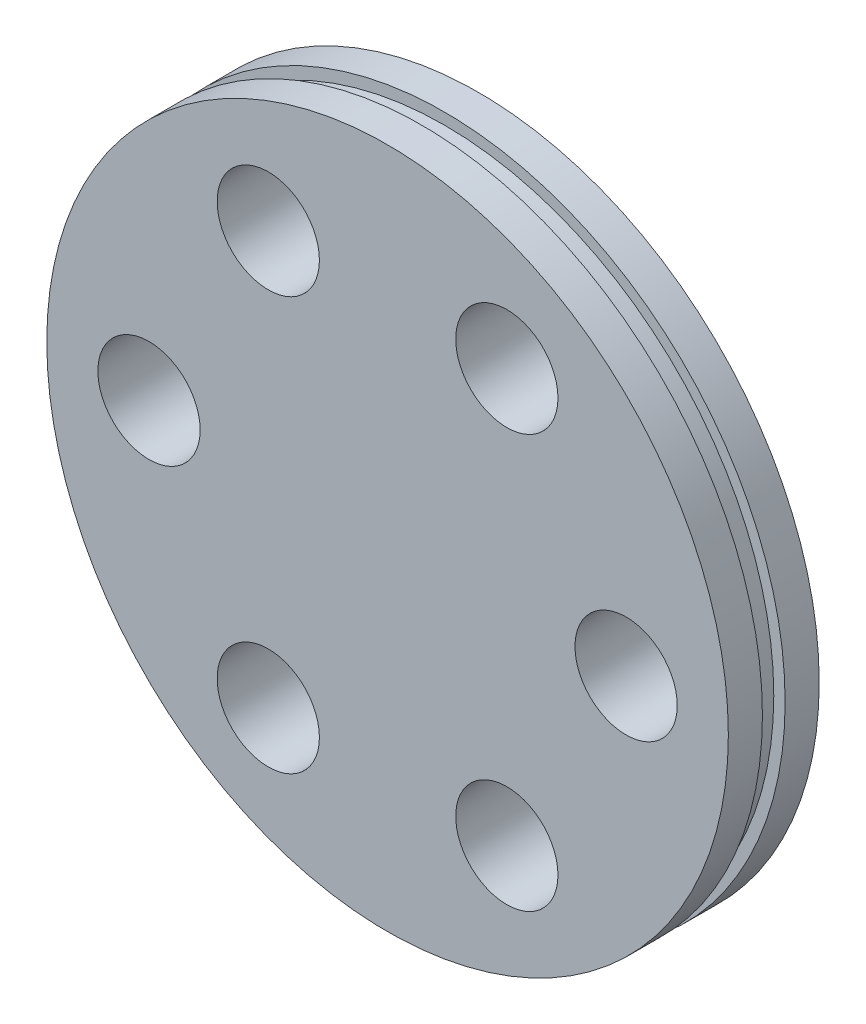
ISO-10303-21;
HEADER;
FILE_DESCRIPTION(('STEP AP214'),'2;1');
FILE_NAME('part.step','',(''),(''),'','','');
FILE_SCHEMA(('AUTOMOTIVE_DESIGN { 1 0 10303 214 1 1 1 1 }'));
ENDSEC;
DATA;
#1=APPLICATION_CONTEXT('core data for automotive mechanical design processes');
#2=APPLICATION_PROTOCOL_DEFINITION('international standard','automotive_design',2000,#1);
#3=PRODUCT_CONTEXT('',#1,'mechanical');
#4=PRODUCT('Part','Part','',(#3));
#5=PRODUCT_RELATED_PRODUCT_CATEGORY('part','',(#4));
#6=PRODUCT_DEFINITION_FORMATION('','',#4);
#7=PRODUCT_DEFINITION_CONTEXT('part definition',#1,'design');
#8=PRODUCT_DEFINITION('design','',#6,#7);
#9=PRODUCT_DEFINITION_SHAPE('','',#8);
#10=(LENGTH_UNIT() NAMED_UNIT(*) SI_UNIT(.MILLI.,.METRE.));
#11=(NAMED_UNIT(*) PLANE_ANGLE_UNIT() SI_UNIT($,.RADIAN.));
#12=(NAMED_UNIT(*) SI_UNIT($,.STERADIAN.) SOLID_ANGLE_UNIT());
#13=UNCERTAINTY_MEASURE_WITH_UNIT(LENGTH_MEASURE(1.E-05),#10,'distance_accuracy_value','');
#14=(GEOMETRIC_REPRESENTATION_CONTEXT(3) GLOBAL_UNCERTAINTY_ASSIGNED_CONTEXT((#13)) GLOBAL_UNIT_ASSIGNED_CONTEXT((#10,
#11,#12)) REPRESENTATION_CONTEXT('',''));
#15=CARTESIAN_POINT('',(0.,0.,0.));
#16=DIRECTION('',(0.,0.,1.));
#17=DIRECTION('',(1.,0.,0.));
#18=AXIS2_PLACEMENT_3D('',#15,#16,#17);
#19=CARTESIAN_POINT('',(0.,0.,6.));
#20=DIRECTION('',(0.,0.,-1.));
#21=DIRECTION('',(-1.,0.,0.));
#22=AXIS2_PLACEMENT_3D('',#19,#20,#21);
#23=CYLINDRICAL_SURFACE('',#22,30.);
#24=CARTESIAN_POINT('',(0.,0.,0.));
#25=DIRECTION('',(0.,0.,1.));
#26=DIRECTION('',(1.,0.,0.));
#27=AXIS2_PLACEMENT_3D('',#24,#25,#26);
#28=CIRCLE('',#27,30.);
#29=CARTESIAN_POINT('',(30.,0.,0.));
#30=VERTEX_POINT('',#29);
#31=EDGE_CURVE('E10',#30,#30,#28,.T.);
#32=ORIENTED_EDGE('',*,*,#31,.T.);
#33=EDGE_LOOP('',(#32));
#34=FACE_BOUND('',#33,.T.);
#35=CARTESIAN_POINT('',(0.,0.,3.));
#36=DIRECTION('',(0.,0.,1.));
#37=DIRECTION('',(1.,0.,0.));
#38=AXIS2_PLACEMENT_3D('',#35,#36,#37);
#39=CIRCLE('',#38,30.);
#40=CARTESIAN_POINT('',(30.,0.,3.));
#41=VERTEX_POINT('',#40);
#42=EDGE_CURVE('E67',#41,#41,#39,.T.);
#43=ORIENTED_EDGE('',*,*,#42,.F.);
#44=EDGE_LOOP('',(#43));
#45=FACE_BOUND('',#44,.T.);
#46=ADVANCED_FACE('F41',(#34,#45),#23,.T.);
#47=CARTESIAN_POINT('',(0.,0.,0.));
#48=DIRECTION('',(0.,0.,1.));
#49=DIRECTION('',(1.,0.,0.));
#50=AXIS2_PLACEMENT_3D('',#47,#48,#49);
#51=PLANE('',#50);
#52=CARTESIAN_POINT('',(21.,0.,0.));
#53=DIRECTION('',(0.,0.,1.));
#54=DIRECTION('',(1.,0.,0.));
#55=AXIS2_PLACEMENT_3D('',#52,#53,#54);
#56=CIRCLE('',#55,4.5);
#57=CARTESIAN_POINT('',(25.5,0.,0.));
#58=VERTEX_POINT('',#57);
#59=EDGE_CURVE('E73',#58,#58,#56,.T.);
#60=ORIENTED_EDGE('',*,*,#59,.T.);
#61=EDGE_LOOP('',(#60));
#62=FACE_BOUND('',#61,.T.);
#63=CARTESIAN_POINT('',(10.5,-18.1865334794732,0.));
#64=DIRECTION('',(0.,0.,1.));
#65=DIRECTION('',(1.,0.,0.));
#66=AXIS2_PLACEMENT_3D('',#63,#64,#65);
#67=CIRCLE('',#66,4.5);
#68=CARTESIAN_POINT('',(15.,-18.1865334794732,0.));
#69=VERTEX_POINT('',#68);
#70=EDGE_CURVE('E100',#69,#69,#67,.T.);
#71=ORIENTED_EDGE('',*,*,#70,.T.);
#72=EDGE_LOOP('',(#71));
#73=FACE_BOUND('',#72,.T.);
#74=CARTESIAN_POINT('',(-10.5,-18.1865334794732,0.));
#75=DIRECTION('',(0.,0.,1.));
#76=DIRECTION('',(1.,0.,0.));
#77=AXIS2_PLACEMENT_3D('',#74,#75,#76);
#78=CIRCLE('',#77,4.5);
#79=CARTESIAN_POINT('',(-6.00000000000001,-18.1865334794732,0.));
#80=VERTEX_POINT('',#79);
#81=EDGE_CURVE('E74',#80,#80,#78,.T.);
#82=ORIENTED_EDGE('',*,*,#81,.T.);
#83=EDGE_LOOP('',(#82));
#84=FACE_BOUND('',#83,.T.);
#85=CARTESIAN_POINT('',(-21.,0.,0.));
#86=DIRECTION('',(0.,0.,1.));
#87=DIRECTION('',(1.,0.,0.));
#88=AXIS2_PLACEMENT_3D('',#85,#86,#87);
#89=CIRCLE('',#88,4.5);
#90=CARTESIAN_POINT('',(-16.5,0.,0.));
#91=VERTEX_POINT('',#90);
#92=EDGE_CURVE('E81',#91,#91,#89,.T.);
#93=ORIENTED_EDGE('',*,*,#92,.T.);
#94=EDGE_LOOP('',(#93));
#95=FACE_BOUND('',#94,.T.);
#96=CARTESIAN_POINT('',(-10.5,18.1865334794732,0.));
#97=DIRECTION('',(0.,0.,1.));
#98=DIRECTION('',(1.,0.,0.));
#99=AXIS2_PLACEMENT_3D('',#96,#97,#98);
#100=CIRCLE('',#99,4.5);
#101=CARTESIAN_POINT('',(-5.99999999999999,18.1865334794732,0.));
#102=VERTEX_POINT('',#101);
#103=EDGE_CURVE('E87',#102,#102,#100,.T.);
#104=ORIENTED_EDGE('',*,*,#103,.T.);
#105=EDGE_LOOP('',(#104));
#106=FACE_BOUND('',#105,.T.);
#107=CARTESIAN_POINT('',(10.5,18.1865334794732,0.));
#108=DIRECTION('',(0.,0.,1.));
#109=DIRECTION('',(1.,0.,0.));
#110=AXIS2_PLACEMENT_3D('',#107,#108,#109);
#111=CIRCLE('',#110,4.5);
#112=CARTESIAN_POINT('',(15.,18.1865334794732,0.));
#113=VERTEX_POINT('',#112);
#114=EDGE_CURVE('E93',#113,#113,#111,.T.);
#115=ORIENTED_EDGE('',*,*,#114,.T.);
#116=EDGE_LOOP('',(#115));
#117=FACE_BOUND('',#116,.T.);
#118=ORIENTED_EDGE('',*,*,#31,.F.);
#119=EDGE_LOOP('',(#118));
#120=FACE_BOUND('',#119,.T.);
#121=CARTESIAN_POINT('',(0.,0.,0.));
#122=DIRECTION('',(0.,0.,1.));
#123=DIRECTION('',(1.,0.,0.));
#124=AXIS2_PLACEMENT_3D('',#121,#122,#123);
#125=CIRCLE('',#124,11.);
#126=CARTESIAN_POINT('',(11.,0.,0.));
#127=VERTEX_POINT('',#126);
#128=EDGE_CURVE('E48',#127,#127,#125,.T.);
#129=ORIENTED_EDGE('',*,*,#128,.T.);
#130=EDGE_LOOP('',(#129));
#131=FACE_BOUND('',#130,.T.);
#132=ADVANCED_FACE('F110',(#62,#73,#84,#95,#106,#117,#120,#131),#51,.F.);
#133=CARTESIAN_POINT('',(0.,0.,6.));
#134=DIRECTION('',(0.,0.,-1.));
#135=DIRECTION('',(-1.,0.,0.));
#136=AXIS2_PLACEMENT_3D('',#133,#134,#135);
#137=CYLINDRICAL_SURFACE('',#136,11.);
#138=CARTESIAN_POINT('',(0.,0.,6.));
#139=DIRECTION('',(0.,0.,1.));
#140=DIRECTION('',(1.,0.,0.));
#141=AXIS2_PLACEMENT_3D('',#138,#139,#140);
#142=CIRCLE('',#141,11.);
#143=CARTESIAN_POINT('',(11.,0.,6.));
#144=VERTEX_POINT('',#143);
#145=EDGE_CURVE('E52',#144,#144,#142,.T.);
#146=ORIENTED_EDGE('',*,*,#145,.T.);
#147=EDGE_LOOP('',(#146));
#148=FACE_BOUND('',#147,.T.);
#149=ORIENTED_EDGE('',*,*,#128,.F.);
#150=EDGE_LOOP('',(#149));
#151=FACE_BOUND('',#150,.T.);
#152=ADVANCED_FACE('F153',(#148,#151),#137,.F.);
#153=CARTESIAN_POINT('',(0.,0.,6.));
#154=DIRECTION('',(0.,0.,1.));
#155=DIRECTION('',(1.,0.,0.));
#156=AXIS2_PLACEMENT_3D('',#153,#154,#155);
#157=PLANE('',#156);
#158=ORIENTED_EDGE('',*,*,#145,.F.);
#159=EDGE_LOOP('',(#158));
#160=FACE_BOUND('',#159,.T.);
#161=ADVANCED_FACE('F171',(#160),#157,.F.);
#162=CARTESIAN_POINT('',(0.,0.,5.));
#163=DIRECTION('',(0.,0.,1.));
#164=DIRECTION('',(1.,0.,0.));
#165=AXIS2_PLACEMENT_3D('',#162,#163,#164);
#166=PLANE('',#165);
#167=CARTESIAN_POINT('',(0.,0.,5.));
#168=DIRECTION('',(0.,0.,1.));
#169=DIRECTION('',(1.,0.,0.));
#170=AXIS2_PLACEMENT_3D('',#167,#168,#169);
#171=CIRCLE('',#170,30.);
#172=CARTESIAN_POINT('',(30.,0.,5.));
#173=VERTEX_POINT('',#172);
#174=EDGE_CURVE('E61',#173,#173,#171,.T.);
#175=ORIENTED_EDGE('',*,*,#174,.F.);
#176=EDGE_LOOP('',(#175));
#177=FACE_BOUND('',#176,.T.);
#178=CARTESIAN_POINT('',(0.,0.,5.));
#179=DIRECTION('',(0.,0.,1.));
#180=DIRECTION('',(1.,0.,0.));
#181=AXIS2_PLACEMENT_3D('',#178,#179,#180);
#182=CIRCLE('',#181,29.);
#183=CARTESIAN_POINT('',(29.,0.,5.));
#184=VERTEX_POINT('',#183);
#185=EDGE_CURVE('E64',#184,#184,#182,.T.);
#186=ORIENTED_EDGE('',*,*,#185,.T.);
#187=EDGE_LOOP('',(#186));
#188=FACE_BOUND('',#187,.T.);
#189=ADVANCED_FACE('F163',(#177,#188),#166,.F.);
#190=CARTESIAN_POINT('',(0.,0.,5.));
#191=DIRECTION('',(0.,0.,-1.));
#192=DIRECTION('',(-1.,0.,0.));
#193=AXIS2_PLACEMENT_3D('',#190,#191,#192);
#194=CYLINDRICAL_SURFACE('',#193,29.);
#195=ORIENTED_EDGE('',*,*,#185,.F.);
#196=EDGE_LOOP('',(#195));
#197=FACE_BOUND('',#196,.T.);
#198=CARTESIAN_POINT('',(0.,0.,3.));
#199=DIRECTION('',(0.,0.,1.));
#200=DIRECTION('',(1.,0.,0.));
#201=AXIS2_PLACEMENT_3D('',#198,#199,#200);
#202=CIRCLE('',#201,29.);
#203=CARTESIAN_POINT('',(29.,0.,3.));
#204=VERTEX_POINT('',#203);
#205=EDGE_CURVE('E70',#204,#204,#202,.T.);
#206=ORIENTED_EDGE('',*,*,#205,.T.);
#207=EDGE_LOOP('',(#206));
#208=FACE_BOUND('',#207,.T.);
#209=ADVANCED_FACE('F157',(#197,#208),#194,.T.);
#210=CARTESIAN_POINT('',(0.,0.,3.));
#211=DIRECTION('',(0.,0.,1.));
#212=DIRECTION('',(1.,0.,0.));
#213=AXIS2_PLACEMENT_3D('',#210,#211,#212);
#214=PLANE('',#213);
#215=ORIENTED_EDGE('',*,*,#205,.F.);
#216=EDGE_LOOP('',(#215));
#217=FACE_BOUND('',#216,.T.);
#218=ORIENTED_EDGE('',*,*,#42,.T.);
#219=EDGE_LOOP('',(#218));
#220=FACE_BOUND('',#219,.T.);
#221=ADVANCED_FACE('F123',(#217,#220),#214,.T.);
#222=CARTESIAN_POINT('',(0.,0.,8.));
#223=DIRECTION('',(0.,0.,1.));
#224=DIRECTION('',(1.,0.,0.));
#225=AXIS2_PLACEMENT_3D('',#222,#223,#224);
#226=PLANE('',#225);
#227=CARTESIAN_POINT('',(21.,0.,8.));
#228=DIRECTION('',(0.,0.,1.));
#229=DIRECTION('',(1.,0.,0.));
#230=AXIS2_PLACEMENT_3D('',#227,#228,#229);
#231=CIRCLE('',#230,4.5);
#232=CARTESIAN_POINT('',(25.5,0.,8.));
#233=VERTEX_POINT('',#232);
#234=EDGE_CURVE('E99',#233,#233,#231,.T.);
#235=ORIENTED_EDGE('',*,*,#234,.F.);
#236=EDGE_LOOP('',(#235));
#237=FACE_BOUND('',#236,.T.);
#238=CARTESIAN_POINT('',(10.5,-18.1865334794732,8.));
#239=DIRECTION('',(0.,0.,1.));
#240=DIRECTION('',(1.,0.,0.));
#241=AXIS2_PLACEMENT_3D('',#238,#239,#240);
#242=CIRCLE('',#241,4.5);
#243=CARTESIAN_POINT('',(15.,-18.1865334794732,8.));
#244=VERTEX_POINT('',#243);
#245=EDGE_CURVE('E78',#244,#244,#242,.T.);
#246=ORIENTED_EDGE('',*,*,#245,.F.);
#247=EDGE_LOOP('',(#246));
#248=FACE_BOUND('',#247,.T.);
#249=CARTESIAN_POINT('',(-10.5,-18.1865334794732,8.));
#250=DIRECTION('',(0.,0.,1.));
#251=DIRECTION('',(1.,0.,0.));
#252=AXIS2_PLACEMENT_3D('',#249,#250,#251);
#253=CIRCLE('',#252,4.5);
#254=CARTESIAN_POINT('',(-6.00000000000001,-18.1865334794732,8.));
#255=VERTEX_POINT('',#254);
#256=EDGE_CURVE('E77',#255,#255,#253,.T.);
#257=ORIENTED_EDGE('',*,*,#256,.F.);
#258=EDGE_LOOP('',(#257));
#259=FACE_BOUND('',#258,.T.);
#260=CARTESIAN_POINT('',(-21.,0.,8.));
#261=DIRECTION('',(0.,0.,1.));
#262=DIRECTION('',(1.,0.,0.));
#263=AXIS2_PLACEMENT_3D('',#260,#261,#262);
#264=CIRCLE('',#263,4.5);
#265=CARTESIAN_POINT('',(-16.5,0.,8.));
#266=VERTEX_POINT('',#265);
#267=EDGE_CURVE('E84',#266,#266,#264,.T.);
#268=ORIENTED_EDGE('',*,*,#267,.F.);
#269=EDGE_LOOP('',(#268));
#270=FACE_BOUND('',#269,.T.);
#271=CARTESIAN_POINT('',(-10.5,18.1865334794732,8.));
#272=DIRECTION('',(0.,0.,1.));
#273=DIRECTION('',(1.,0.,0.));
#274=AXIS2_PLACEMENT_3D('',#271,#272,#273);
#275=CIRCLE('',#274,4.5);
#276=CARTESIAN_POINT('',(-5.99999999999999,18.1865334794732,8.));
#277=VERTEX_POINT('',#276);
#278=EDGE_CURVE('E90',#277,#277,#275,.T.);
#279=ORIENTED_EDGE('',*,*,#278,.F.);
#280=EDGE_LOOP('',(#279));
#281=FACE_BOUND('',#280,.T.);
#282=CARTESIAN_POINT('',(10.5,18.1865334794732,8.));
#283=DIRECTION('',(0.,0.,1.));
#284=DIRECTION('',(1.,0.,0.));
#285=AXIS2_PLACEMENT_3D('',#282,#283,#284);
#286=CIRCLE('',#285,4.5);
#287=CARTESIAN_POINT('',(15.,18.1865334794732,8.));
#288=VERTEX_POINT('',#287);
#289=EDGE_CURVE('E96',#288,#288,#286,.T.);
#290=ORIENTED_EDGE('',*,*,#289,.F.);
#291=EDGE_LOOP('',(#290));
#292=FACE_BOUND('',#291,.T.);
#293=CARTESIAN_POINT('',(0.,0.,8.));
#294=DIRECTION('',(0.,0.,1.));
#295=DIRECTION('',(1.,0.,0.));
#296=AXIS2_PLACEMENT_3D('',#293,#294,#295);
#297=CIRCLE('',#296,30.);
#298=CARTESIAN_POINT('',(30.,0.,8.));
#299=VERTEX_POINT('',#298);
#300=EDGE_CURVE('E56',#299,#299,#297,.T.);
#301=ORIENTED_EDGE('',*,*,#300,.T.);
#302=EDGE_LOOP('',(#301));
#303=FACE_BOUND('',#302,.T.);
#304=ADVANCED_FACE('F120',(#237,#248,#259,#270,#281,#292,#303),#226,.T.);
#305=ORIENTED_EDGE('',*,*,#174,.T.);
#306=EDGE_LOOP('',(#305));
#307=FACE_BOUND('',#306,.T.);
#308=ORIENTED_EDGE('',*,*,#300,.F.);
#309=EDGE_LOOP('',(#308));
#310=FACE_BOUND('',#309,.T.);
#311=ADVANCED_FACE('F43',(#307,#310),#23,.T.);
#312=CARTESIAN_POINT('',(10.5,18.1865334794732,0.));
#313=DIRECTION('',(0.,0.,1.));
#314=DIRECTION('',(1.,0.,0.));
#315=AXIS2_PLACEMENT_3D('',#312,#313,#314);
#316=CYLINDRICAL_SURFACE('',#315,4.5);
#317=ORIENTED_EDGE('',*,*,#114,.F.);
#318=EDGE_LOOP('',(#317));
#319=FACE_BOUND('',#318,.T.);
#320=ORIENTED_EDGE('',*,*,#289,.T.);
#321=EDGE_LOOP('',(#320));
#322=FACE_BOUND('',#321,.T.);
#323=ADVANCED_FACE('F138',(#319,#322),#316,.F.);
#324=CARTESIAN_POINT('',(-10.5,18.1865334794732,0.));
#325=DIRECTION('',(0.,0.,1.));
#326=DIRECTION('',(1.,0.,0.));
#327=AXIS2_PLACEMENT_3D('',#324,#325,#326);
#328=CYLINDRICAL_SURFACE('',#327,4.5);
#329=ORIENTED_EDGE('',*,*,#103,.F.);
#330=EDGE_LOOP('',(#329));
#331=FACE_BOUND('',#330,.T.);
#332=ORIENTED_EDGE('',*,*,#278,.T.);
#333=EDGE_LOOP('',(#332));
#334=FACE_BOUND('',#333,.T.);
#335=ADVANCED_FACE('F145',(#331,#334),#328,.F.);
#336=CARTESIAN_POINT('',(-21.,0.,0.));
#337=DIRECTION('',(0.,0.,1.));
#338=DIRECTION('',(1.,0.,0.));
#339=AXIS2_PLACEMENT_3D('',#336,#337,#338);
#340=CYLINDRICAL_SURFACE('',#339,4.5);
#341=ORIENTED_EDGE('',*,*,#92,.F.);
#342=EDGE_LOOP('',(#341));
#343=FACE_BOUND('',#342,.T.);
#344=ORIENTED_EDGE('',*,*,#267,.T.);
#345=EDGE_LOOP('',(#344));
#346=FACE_BOUND('',#345,.T.);
#347=ADVANCED_FACE('F235',(#343,#346),#340,.F.);
#348=CARTESIAN_POINT('',(-10.5,-18.1865334794732,0.));
#349=DIRECTION('',(0.,0.,1.));
#350=DIRECTION('',(1.,0.,0.));
#351=AXIS2_PLACEMENT_3D('',#348,#349,#350);
#352=CYLINDRICAL_SURFACE('',#351,4.5);
#353=ORIENTED_EDGE('',*,*,#81,.F.);
#354=EDGE_LOOP('',(#353));
#355=FACE_BOUND('',#354,.T.);
#356=ORIENTED_EDGE('',*,*,#256,.T.);
#357=EDGE_LOOP('',(#356));
#358=FACE_BOUND('',#357,.T.);
#359=ADVANCED_FACE('F168',(#355,#358),#352,.F.);
#360=CARTESIAN_POINT('',(10.5,-18.1865334794732,0.));
#361=DIRECTION('',(0.,0.,1.));
#362=DIRECTION('',(1.,0.,0.));
#363=AXIS2_PLACEMENT_3D('',#360,#361,#362);
#364=CYLINDRICAL_SURFACE('',#363,4.5);
#365=ORIENTED_EDGE('',*,*,#70,.F.);
#366=EDGE_LOOP('',(#365));
#367=FACE_BOUND('',#366,.T.);
#368=ORIENTED_EDGE('',*,*,#245,.T.);
#369=EDGE_LOOP('',(#368));
#370=FACE_BOUND('',#369,.T.);
#371=ADVANCED_FACE('F116',(#367,#370),#364,.F.);
#372=CARTESIAN_POINT('',(21.,0.,0.));
#373=DIRECTION('',(0.,0.,1.));
#374=DIRECTION('',(1.,0.,0.));
#375=AXIS2_PLACEMENT_3D('',#372,#373,#374);
#376=CYLINDRICAL_SURFACE('',#375,4.5);
#377=ORIENTED_EDGE('',*,*,#59,.F.);
#378=EDGE_LOOP('',(#377));
#379=FACE_BOUND('',#378,.T.);
#380=ORIENTED_EDGE('',*,*,#234,.T.);
#381=EDGE_LOOP('',(#380));
#382=FACE_BOUND('',#381,.T.);
#383=ADVANCED_FACE('F113',(#379,#382),#376,.F.);
#384=CLOSED_SHELL('',(#46,#132,#152,#161,#189,#209,#221,#304,#311,#323,#335,#347,#359,#371,#383));
#385=MANIFOLD_SOLID_BREP('B2',#384);
#386=ADVANCED_BREP_SHAPE_REPRESENTATION('',(#18,#385),#14);
#387=SHAPE_DEFINITION_REPRESENTATION(#9,#386);
ENDSEC;
END-ISO-10303-21;
